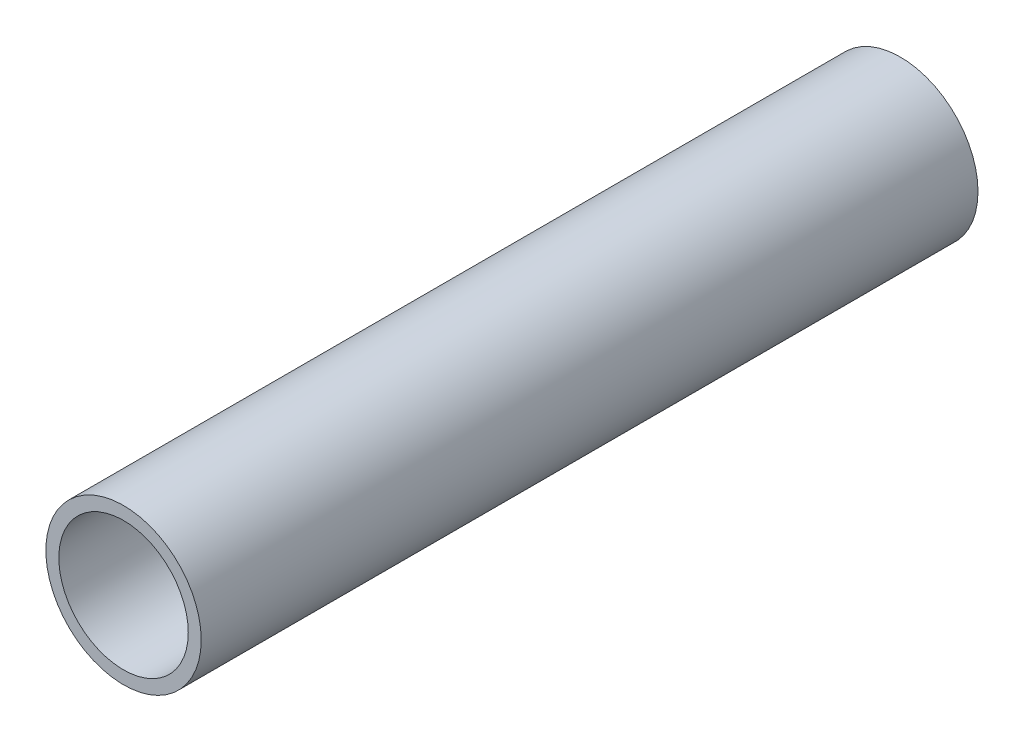
ISO-10303-21;
HEADER;
FILE_DESCRIPTION(('STEP AP214'),'2;1');
FILE_NAME('part.step','',(''),(''),'','','');
FILE_SCHEMA(('AUTOMOTIVE_DESIGN { 1 0 10303 214 1 1 1 1 }'));
ENDSEC;
DATA;
#1=APPLICATION_CONTEXT('core data for automotive mechanical design processes');
#2=APPLICATION_PROTOCOL_DEFINITION('international standard','automotive_design',2000,#1);
#3=PRODUCT_CONTEXT('',#1,'mechanical');
#4=PRODUCT('Part','Part','',(#3));
#5=PRODUCT_RELATED_PRODUCT_CATEGORY('part','',(#4));
#6=PRODUCT_DEFINITION_FORMATION('','',#4);
#7=PRODUCT_DEFINITION_CONTEXT('part definition',#1,'design');
#8=PRODUCT_DEFINITION('design','',#6,#7);
#9=PRODUCT_DEFINITION_SHAPE('','',#8);
#10=(LENGTH_UNIT() NAMED_UNIT(*) SI_UNIT(.MILLI.,.METRE.));
#11=(NAMED_UNIT(*) PLANE_ANGLE_UNIT() SI_UNIT($,.RADIAN.));
#12=(NAMED_UNIT(*) SI_UNIT($,.STERADIAN.) SOLID_ANGLE_UNIT());
#13=UNCERTAINTY_MEASURE_WITH_UNIT(LENGTH_MEASURE(1.E-05),#10,'distance_accuracy_value','');
#14=(GEOMETRIC_REPRESENTATION_CONTEXT(3) GLOBAL_UNCERTAINTY_ASSIGNED_CONTEXT((#13)) GLOBAL_UNIT_ASSIGNED_CONTEXT((#10,
#11,#12)) REPRESENTATION_CONTEXT('',''));
#15=CARTESIAN_POINT('',(0.,0.,0.));
#16=DIRECTION('',(0.,0.,1.));
#17=DIRECTION('',(1.,0.,0.));
#18=AXIS2_PLACEMENT_3D('',#15,#16,#17);
#19=CARTESIAN_POINT('',(0.,0.,60.));
#20=DIRECTION('',(0.,0.,1.));
#21=DIRECTION('',(1.,0.,0.));
#22=AXIS2_PLACEMENT_3D('',#19,#20,#21);
#23=PLANE('',#22);
#24=CARTESIAN_POINT('',(0.,0.,60.));
#25=DIRECTION('',(0.,0.,1.));
#26=DIRECTION('',(1.,0.,0.));
#27=AXIS2_PLACEMENT_3D('',#24,#25,#26);
#28=CIRCLE('',#27,6.);
#29=CARTESIAN_POINT('',(6.,0.,60.));
#30=VERTEX_POINT('',#29);
#31=EDGE_CURVE('E10',#30,#30,#28,.T.);
#32=ORIENTED_EDGE('',*,*,#31,.T.);
#33=EDGE_LOOP('',(#32));
#34=FACE_BOUND('',#33,.T.);
#35=CARTESIAN_POINT('',(0.,0.,60.));
#36=DIRECTION('',(0.,0.,1.));
#37=DIRECTION('',(1.,0.,0.));
#38=AXIS2_PLACEMENT_3D('',#35,#36,#37);
#39=CIRCLE('',#38,5.);
#40=CARTESIAN_POINT('',(5.,0.,60.));
#41=VERTEX_POINT('',#40);
#42=EDGE_CURVE('E50',#41,#41,#39,.T.);
#43=ORIENTED_EDGE('',*,*,#42,.F.);
#44=EDGE_LOOP('',(#43));
#45=FACE_BOUND('',#44,.T.);
#46=ADVANCED_FACE('F37',(#34,#45),#23,.T.);
#47=CARTESIAN_POINT('',(0.,0.,0.));
#48=DIRECTION('',(0.,0.,1.));
#49=DIRECTION('',(1.,0.,0.));
#50=AXIS2_PLACEMENT_3D('',#47,#48,#49);
#51=PLANE('',#50);
#52=CARTESIAN_POINT('',(0.,0.,0.));
#53=DIRECTION('',(0.,0.,1.));
#54=DIRECTION('',(1.,0.,0.));
#55=AXIS2_PLACEMENT_3D('',#52,#53,#54);
#56=CIRCLE('',#55,6.);
#57=CARTESIAN_POINT('',(6.,0.,0.));
#58=VERTEX_POINT('',#57);
#59=EDGE_CURVE('E41',#58,#58,#56,.T.);
#60=ORIENTED_EDGE('',*,*,#59,.F.);
#61=EDGE_LOOP('',(#60));
#62=FACE_BOUND('',#61,.T.);
#63=CARTESIAN_POINT('',(0.,0.,0.));
#64=DIRECTION('',(0.,0.,1.));
#65=DIRECTION('',(1.,0.,0.));
#66=AXIS2_PLACEMENT_3D('',#63,#64,#65);
#67=CIRCLE('',#66,5.);
#68=CARTESIAN_POINT('',(5.,0.,0.));
#69=VERTEX_POINT('',#68);
#70=EDGE_CURVE('E52',#69,#69,#67,.T.);
#71=ORIENTED_EDGE('',*,*,#70,.T.);
#72=EDGE_LOOP('',(#71));
#73=FACE_BOUND('',#72,.T.);
#74=ADVANCED_FACE('F64',(#62,#73),#51,.F.);
#75=CARTESIAN_POINT('',(0.,0.,60.));
#76=DIRECTION('',(0.,0.,-1.));
#77=DIRECTION('',(-1.,0.,0.));
#78=AXIS2_PLACEMENT_3D('',#75,#76,#77);
#79=CYLINDRICAL_SURFACE('',#78,6.);
#80=ORIENTED_EDGE('',*,*,#31,.F.);
#81=EDGE_LOOP('',(#80));
#82=FACE_BOUND('',#81,.T.);
#83=ORIENTED_EDGE('',*,*,#59,.T.);
#84=EDGE_LOOP('',(#83));
#85=FACE_BOUND('',#84,.T.);
#86=ADVANCED_FACE('F39',(#82,#85),#79,.T.);
#87=CARTESIAN_POINT('',(0.,0.,60.));
#88=DIRECTION('',(0.,0.,-1.));
#89=DIRECTION('',(-1.,0.,0.));
#90=AXIS2_PLACEMENT_3D('',#87,#88,#89);
#91=CYLINDRICAL_SURFACE('',#90,5.);
#92=ORIENTED_EDGE('',*,*,#42,.T.);
#93=EDGE_LOOP('',(#92));
#94=FACE_BOUND('',#93,.T.);
#95=ORIENTED_EDGE('',*,*,#70,.F.);
#96=EDGE_LOOP('',(#95));
#97=FACE_BOUND('',#96,.T.);
#98=ADVANCED_FACE('F60',(#94,#97),#91,.F.);
#99=CLOSED_SHELL('',(#46,#74,#86,#98));
#100=MANIFOLD_SOLID_BREP('B2',#99);
#101=ADVANCED_BREP_SHAPE_REPRESENTATION('',(#18,#100),#14);
#102=SHAPE_DEFINITION_REPRESENTATION(#9,#101);
ENDSEC;
END-ISO-10303-21;
